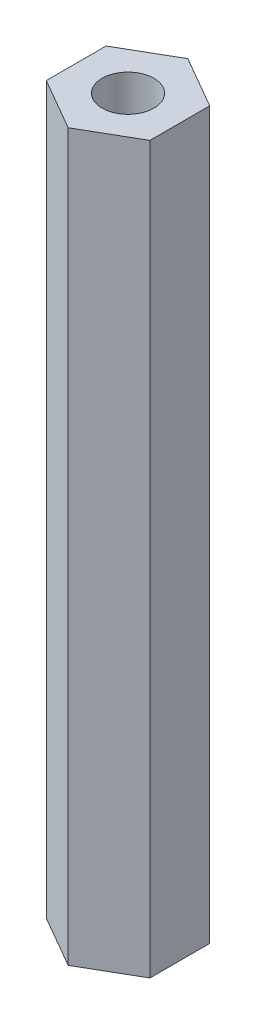
ISO-10303-21;
HEADER;
FILE_DESCRIPTION(('STEP AP214'),'2;1');
FILE_NAME('part.step','',(''),(''),'','','');
FILE_SCHEMA(('AUTOMOTIVE_DESIGN { 1 0 10303 214 1 1 1 1 }'));
ENDSEC;
DATA;
#1=APPLICATION_CONTEXT('core data for automotive mechanical design processes');
#2=APPLICATION_PROTOCOL_DEFINITION('international standard','automotive_design',2000,#1);
#3=PRODUCT_CONTEXT('',#1,'mechanical');
#4=PRODUCT('Part','Part','',(#3));
#5=PRODUCT_RELATED_PRODUCT_CATEGORY('part','',(#4));
#6=PRODUCT_DEFINITION_FORMATION('','',#4);
#7=PRODUCT_DEFINITION_CONTEXT('part definition',#1,'design');
#8=PRODUCT_DEFINITION('design','',#6,#7);
#9=PRODUCT_DEFINITION_SHAPE('','',#8);
#10=(LENGTH_UNIT() NAMED_UNIT(*) SI_UNIT(.MILLI.,.METRE.));
#11=(NAMED_UNIT(*) PLANE_ANGLE_UNIT() SI_UNIT($,.RADIAN.));
#12=(NAMED_UNIT(*) SI_UNIT($,.STERADIAN.) SOLID_ANGLE_UNIT());
#13=UNCERTAINTY_MEASURE_WITH_UNIT(LENGTH_MEASURE(1.E-05),#10,'distance_accuracy_value','');
#14=(GEOMETRIC_REPRESENTATION_CONTEXT(3) GLOBAL_UNCERTAINTY_ASSIGNED_CONTEXT((#13)) GLOBAL_UNIT_ASSIGNED_CONTEXT((#10,
#11,#12)) REPRESENTATION_CONTEXT('',''));
#15=CARTESIAN_POINT('',(0.,0.,0.));
#16=DIRECTION('',(0.,0.,1.));
#17=DIRECTION('',(1.,0.,0.));
#18=AXIS2_PLACEMENT_3D('',#15,#16,#17);
#19=CARTESIAN_POINT('',(0.,23.71137043753,0.));
#20=DIRECTION('',(0.,-1.,0.));
#21=DIRECTION('',(1.,0.,0.));
#22=AXIS2_PLACEMENT_3D('',#19,#20,#21);
#23=CYLINDRICAL_SURFACE('',#22,1.25);
#24=CARTESIAN_POINT('',(0.,35.00000000001,0.));
#25=DIRECTION('',(0.,1.,0.));
#26=DIRECTION('',(-1.,0.,0.));
#27=AXIS2_PLACEMENT_3D('',#24,#25,#26);
#28=CIRCLE('',#27,1.25);
#29=CARTESIAN_POINT('',(-1.25,35.00000000001,0.));
#30=VERTEX_POINT('',#29);
#31=EDGE_CURVE('E101',#30,#30,#28,.T.);
#32=ORIENTED_EDGE('',*,*,#31,.T.);
#33=EDGE_LOOP('',(#32));
#34=FACE_BOUND('',#33,.T.);
#35=CARTESIAN_POINT('',(0.,25.00000000001,0.));
#36=DIRECTION('',(0.,1.,0.));
#37=DIRECTION('',(1.,0.,0.));
#38=AXIS2_PLACEMENT_3D('',#35,#36,#37);
#39=CIRCLE('',#38,1.25);
#40=CARTESIAN_POINT('',(1.25,25.00000000001,0.));
#41=VERTEX_POINT('',#40);
#42=EDGE_CURVE('E11',#41,#41,#39,.T.);
#43=ORIENTED_EDGE('',*,*,#42,.F.);
#44=EDGE_LOOP('',(#43));
#45=FACE_BOUND('',#44,.T.);
#46=ADVANCED_FACE('F17',(#34,#45),#23,.F.);
#47=CARTESIAN_POINT('',(2.5,0.,1.443375672974));
#48=DIRECTION('',(1.,0.,0.));
#49=DIRECTION('',(0.,1.,0.));
#50=AXIS2_PLACEMENT_3D('',#47,#48,#49);
#51=PLANE('',#50);
#52=DIRECTION('',(0.,1.,0.));
#53=VECTOR('',#52,1.);
#54=CARTESIAN_POINT('',(2.50000000001,0.,-1.443375672984));
#55=LINE('',#54,#53);
#56=CARTESIAN_POINT('',(2.5,0.,-1.443375672974));
#57=VERTEX_POINT('',#56);
#58=CARTESIAN_POINT('',(2.5,35.,-1.443375672974));
#59=VERTEX_POINT('',#58);
#60=EDGE_CURVE('E122',#57,#59,#55,.T.);
#61=ORIENTED_EDGE('',*,*,#60,.T.);
#62=DIRECTION('',(0.,0.,-1.));
#63=VECTOR('',#62,1.);
#64=CARTESIAN_POINT('',(2.50000000001,35.00000000001,1.443375672984));
#65=LINE('',#64,#63);
#66=CARTESIAN_POINT('',(2.5,35.,1.443375672974));
#67=VERTEX_POINT('',#66);
#68=EDGE_CURVE('E105',#67,#59,#65,.T.);
#69=ORIENTED_EDGE('',*,*,#68,.F.);
#70=DIRECTION('',(0.,1.,0.));
#71=VECTOR('',#70,1.);
#72=CARTESIAN_POINT('',(2.50000000001,0.,1.443375672984));
#73=LINE('',#72,#71);
#74=CARTESIAN_POINT('',(2.5,0.,1.443375672974));
#75=VERTEX_POINT('',#74);
#76=EDGE_CURVE('E175',#75,#67,#73,.T.);
#77=ORIENTED_EDGE('',*,*,#76,.F.);
#78=DIRECTION('',(0.,0.,-1.));
#79=VECTOR('',#78,1.);
#80=CARTESIAN_POINT('',(2.50000000001,0.,1.443375672984));
#81=LINE('',#80,#79);
#82=EDGE_CURVE('E123',#75,#57,#81,.T.);
#83=ORIENTED_EDGE('',*,*,#82,.T.);
#84=EDGE_LOOP('',(#61,#69,#77,#83));
#85=FACE_BOUND('',#84,.T.);
#86=ADVANCED_FACE('F199',(#85),#51,.T.);
#87=CARTESIAN_POINT('',(0.,24.63553243691,0.));
#88=DIRECTION('',(0.,1.,0.));
#89=DIRECTION('',(1.,0.,0.));
#90=AXIS2_PLACEMENT_3D('',#87,#88,#89);
#91=CONICAL_SURFACE('',#90,0.6434241,1.0297442587);
#92=CARTESIAN_POINT('',(0.,24.24892422622,0.));
#93=VERTEX_POINT('',#92);
#94=VERTEX_LOOP('',#93);
#95=FACE_BOUND('',#94,.T.);
#96=ORIENTED_EDGE('',*,*,#42,.T.);
#97=EDGE_LOOP('',(#96));
#98=FACE_BOUND('',#97,.T.);
#99=ADVANCED_FACE('F319',(#95,#98),#91,.F.);
#100=CARTESIAN_POINT('',(0.,11.28862956247,0.));
#101=DIRECTION('',(0.,-1.,0.));
#102=DIRECTION('',(1.,0.,0.));
#103=AXIS2_PLACEMENT_3D('',#100,#101,#102);
#104=CYLINDRICAL_SURFACE('',#103,1.25);
#105=CARTESIAN_POINT('',(0.,0.,0.));
#106=DIRECTION('',(0.,1.,0.));
#107=DIRECTION('',(-1.,0.,0.));
#108=AXIS2_PLACEMENT_3D('',#105,#106,#107);
#109=CIRCLE('',#108,1.25);
#110=CARTESIAN_POINT('',(-1.25,0.,0.));
#111=VERTEX_POINT('',#110);
#112=EDGE_CURVE('E132',#111,#111,#109,.T.);
#113=ORIENTED_EDGE('',*,*,#112,.F.);
#114=EDGE_LOOP('',(#113));
#115=FACE_BOUND('',#114,.T.);
#116=CARTESIAN_POINT('',(0.,10.00000000001,0.));
#117=DIRECTION('',(0.,1.,0.));
#118=DIRECTION('',(1.,0.,0.));
#119=AXIS2_PLACEMENT_3D('',#116,#117,#118);
#120=CIRCLE('',#119,1.25);
#121=CARTESIAN_POINT('',(1.25,10.00000000001,0.));
#122=VERTEX_POINT('',#121);
#123=EDGE_CURVE('E26',#122,#122,#120,.T.);
#124=ORIENTED_EDGE('',*,*,#123,.T.);
#125=EDGE_LOOP('',(#124));
#126=FACE_BOUND('',#125,.T.);
#127=ADVANCED_FACE('F356',(#115,#126),#104,.F.);
#128=CARTESIAN_POINT('',(-2.5,0.,1.443375672974));
#129=DIRECTION('',(-0.500000000000017,0.,0.866025403784429));
#130=DIRECTION('',(0.,1.,0.));
#131=AXIS2_PLACEMENT_3D('',#128,#129,#130);
#132=PLANE('',#131);
#133=DIRECTION('',(0.,1.,0.));
#134=VECTOR('',#133,1.);
#135=CARTESIAN_POINT('',(0.,0.,2.886751345958));
#136=LINE('',#135,#134);
#137=CARTESIAN_POINT('',(0.,0.,2.886751345948));
#138=VERTEX_POINT('',#137);
#139=CARTESIAN_POINT('',(0.,35.,2.886751345948));
#140=VERTEX_POINT('',#139);
#141=EDGE_CURVE('E164',#138,#140,#136,.T.);
#142=ORIENTED_EDGE('',*,*,#141,.T.);
#143=DIRECTION('',(0.866025403783795,0.,0.500000000001115));
#144=VECTOR('',#143,1.);
#145=CARTESIAN_POINT('',(-2.50000000001,35.00000000001,1.443375672984));
#146=LINE('',#145,#144);
#147=CARTESIAN_POINT('',(-2.5,35.,1.443375672974));
#148=VERTEX_POINT('',#147);
#149=EDGE_CURVE('E112',#148,#140,#146,.T.);
#150=ORIENTED_EDGE('',*,*,#149,.F.);
#151=DIRECTION('',(0.,1.,0.));
#152=VECTOR('',#151,1.);
#153=CARTESIAN_POINT('',(-2.50000000001,0.,1.443375672984));
#154=LINE('',#153,#152);
#155=CARTESIAN_POINT('',(-2.5,0.,1.443375672974));
#156=VERTEX_POINT('',#155);
#157=EDGE_CURVE('E146',#156,#148,#154,.T.);
#158=ORIENTED_EDGE('',*,*,#157,.F.);
#159=DIRECTION('',(0.866025403783795,0.,0.500000000001115));
#160=VECTOR('',#159,1.);
#161=CARTESIAN_POINT('',(-2.50000000001,0.,1.443375672984));
#162=LINE('',#161,#160);
#163=EDGE_CURVE('E126',#156,#138,#162,.T.);
#164=ORIENTED_EDGE('',*,*,#163,.T.);
#165=EDGE_LOOP('',(#142,#150,#158,#164));
#166=FACE_BOUND('',#165,.T.);
#167=ADVANCED_FACE('F165',(#166),#132,.T.);
#168=CARTESIAN_POINT('',(0.,10.36446756309,0.));
#169=DIRECTION('',(0.,-1.,0.));
#170=DIRECTION('',(-1.,0.,0.));
#171=AXIS2_PLACEMENT_3D('',#168,#169,#170);
#172=CONICAL_SURFACE('',#171,0.6434241,1.0297442587);
#173=CARTESIAN_POINT('',(0.,10.75107577378,0.));
#174=VERTEX_POINT('',#173);
#175=VERTEX_LOOP('',#174);
#176=FACE_BOUND('',#175,.T.);
#177=ORIENTED_EDGE('',*,*,#123,.F.);
#178=EDGE_LOOP('',(#177));
#179=FACE_BOUND('',#178,.T.);
#180=ADVANCED_FACE('F339',(#176,#179),#172,.F.);
#181=CARTESIAN_POINT('',(0.,35.,0.));
#182=DIRECTION('',(0.,1.,0.));
#183=DIRECTION('',(1.,0.,0.));
#184=AXIS2_PLACEMENT_3D('',#181,#182,#183);
#185=PLANE('',#184);
#186=ORIENTED_EDGE('',*,*,#31,.F.);
#187=EDGE_LOOP('',(#186));
#188=FACE_BOUND('',#187,.T.);
#189=DIRECTION('',(0.,0.,1.));
#190=VECTOR('',#189,1.);
#191=CARTESIAN_POINT('',(-2.50000000001,35.00000000001,-1.443375672984));
#192=LINE('',#191,#190);
#193=CARTESIAN_POINT('',(-2.5,35.,-1.443375672974));
#194=VERTEX_POINT('',#193);
#195=EDGE_CURVE('E147',#194,#148,#192,.T.);
#196=ORIENTED_EDGE('',*,*,#195,.T.);
#197=ORIENTED_EDGE('',*,*,#149,.T.);
#198=DIRECTION('',(0.866025403783795,0.,-0.500000000001115));
#199=VECTOR('',#198,1.);
#200=CARTESIAN_POINT('',(0.,35.00000000001,2.886751345958));
#201=LINE('',#200,#199);
#202=EDGE_CURVE('E159',#140,#67,#201,.T.);
#203=ORIENTED_EDGE('',*,*,#202,.T.);
#204=ORIENTED_EDGE('',*,*,#68,.T.);
#205=DIRECTION('',(-0.866025403783795,0.,-0.500000000001115));
#206=VECTOR('',#205,1.);
#207=CARTESIAN_POINT('',(2.50000000001,35.00000000001,-1.443375672984));
#208=LINE('',#207,#206);
#209=CARTESIAN_POINT('',(0.,35.,-2.886751345948));
#210=VERTEX_POINT('',#209);
#211=EDGE_CURVE('E118',#59,#210,#208,.T.);
#212=ORIENTED_EDGE('',*,*,#211,.T.);
#213=DIRECTION('',(-0.866025403783795,0.,0.500000000001115));
#214=VECTOR('',#213,1.);
#215=CARTESIAN_POINT('',(0.,35.00000000001,-2.886751345958));
#216=LINE('',#215,#214);
#217=EDGE_CURVE('E142',#210,#194,#216,.T.);
#218=ORIENTED_EDGE('',*,*,#217,.T.);
#219=EDGE_LOOP('',(#196,#197,#203,#204,#212,#218));
#220=FACE_BOUND('',#219,.T.);
#221=ADVANCED_FACE('F157',(#188,#220),#185,.T.);
#222=CARTESIAN_POINT('',(-2.5,0.,-1.443375672974));
#223=DIRECTION('',(-1.,0.,0.));
#224=DIRECTION('',(0.,0.,1.));
#225=AXIS2_PLACEMENT_3D('',#222,#223,#224);
#226=PLANE('',#225);
#227=ORIENTED_EDGE('',*,*,#157,.T.);
#228=ORIENTED_EDGE('',*,*,#195,.F.);
#229=DIRECTION('',(0.,1.,0.));
#230=VECTOR('',#229,1.);
#231=CARTESIAN_POINT('',(-2.50000000001,0.,-1.443375672984));
#232=LINE('',#231,#230);
#233=CARTESIAN_POINT('',(-2.5,0.,-1.443375672974));
#234=VERTEX_POINT('',#233);
#235=EDGE_CURVE('E138',#234,#194,#232,.T.);
#236=ORIENTED_EDGE('',*,*,#235,.F.);
#237=DIRECTION('',(0.,0.,1.));
#238=VECTOR('',#237,1.);
#239=CARTESIAN_POINT('',(-2.50000000001,0.,-1.443375672984));
#240=LINE('',#239,#238);
#241=EDGE_CURVE('E133',#234,#156,#240,.T.);
#242=ORIENTED_EDGE('',*,*,#241,.T.);
#243=EDGE_LOOP('',(#227,#228,#236,#242));
#244=FACE_BOUND('',#243,.T.);
#245=ADVANCED_FACE('F190',(#244),#226,.T.);
#246=CARTESIAN_POINT('',(0.,0.,-2.886751345948));
#247=DIRECTION('',(-0.500000000000017,0.,-0.866025403784429));
#248=DIRECTION('',(-0.866025403784429,0.,0.500000000000017));
#249=AXIS2_PLACEMENT_3D('',#246,#247,#248);
#250=PLANE('',#249);
#251=ORIENTED_EDGE('',*,*,#235,.T.);
#252=ORIENTED_EDGE('',*,*,#217,.F.);
#253=DIRECTION('',(0.,1.,0.));
#254=VECTOR('',#253,1.);
#255=CARTESIAN_POINT('',(0.,0.,-2.886751345958));
#256=LINE('',#255,#254);
#257=CARTESIAN_POINT('',(0.,0.,-2.886751345948));
#258=VERTEX_POINT('',#257);
#259=EDGE_CURVE('E116',#258,#210,#256,.T.);
#260=ORIENTED_EDGE('',*,*,#259,.F.);
#261=DIRECTION('',(-0.866025403783795,0.,0.500000000001115));
#262=VECTOR('',#261,1.);
#263=CARTESIAN_POINT('',(0.,0.,-2.886751345958));
#264=LINE('',#263,#262);
#265=EDGE_CURVE('E128',#258,#234,#264,.T.);
#266=ORIENTED_EDGE('',*,*,#265,.T.);
#267=EDGE_LOOP('',(#251,#252,#260,#266));
#268=FACE_BOUND('',#267,.T.);
#269=ADVANCED_FACE('F274',(#268),#250,.T.);
#270=CARTESIAN_POINT('',(0.,0.,0.));
#271=DIRECTION('',(0.,1.,0.));
#272=DIRECTION('',(1.,0.,0.));
#273=AXIS2_PLACEMENT_3D('',#270,#271,#272);
#274=PLANE('',#273);
#275=ORIENTED_EDGE('',*,*,#112,.T.);
#276=EDGE_LOOP('',(#275));
#277=FACE_BOUND('',#276,.T.);
#278=DIRECTION('',(-0.866025403783795,0.,-0.500000000001115));
#279=VECTOR('',#278,1.);
#280=CARTESIAN_POINT('',(2.50000000001,0.,-1.443375672984));
#281=LINE('',#280,#279);
#282=EDGE_CURVE('E127',#57,#258,#281,.T.);
#283=ORIENTED_EDGE('',*,*,#282,.F.);
#284=ORIENTED_EDGE('',*,*,#82,.F.);
#285=DIRECTION('',(0.866025403783795,0.,-0.500000000001115));
#286=VECTOR('',#285,1.);
#287=CARTESIAN_POINT('',(0.,0.,2.886751345958));
#288=LINE('',#287,#286);
#289=EDGE_CURVE('E171',#138,#75,#288,.T.);
#290=ORIENTED_EDGE('',*,*,#289,.F.);
#291=ORIENTED_EDGE('',*,*,#163,.F.);
#292=ORIENTED_EDGE('',*,*,#241,.F.);
#293=ORIENTED_EDGE('',*,*,#265,.F.);
#294=EDGE_LOOP('',(#283,#284,#290,#291,#292,#293));
#295=FACE_BOUND('',#294,.T.);
#296=ADVANCED_FACE('F196',(#277,#295),#274,.F.);
#297=CARTESIAN_POINT('',(2.5,0.,-1.443375672974));
#298=DIRECTION('',(0.500000000000017,0.,-0.866025403784429));
#299=DIRECTION('',(0.,-1.,0.));
#300=AXIS2_PLACEMENT_3D('',#297,#298,#299);
#301=PLANE('',#300);
#302=ORIENTED_EDGE('',*,*,#259,.T.);
#303=ORIENTED_EDGE('',*,*,#211,.F.);
#304=ORIENTED_EDGE('',*,*,#60,.F.);
#305=ORIENTED_EDGE('',*,*,#282,.T.);
#306=EDGE_LOOP('',(#302,#303,#304,#305));
#307=FACE_BOUND('',#306,.T.);
#308=ADVANCED_FACE('F206',(#307),#301,.T.);
#309=CARTESIAN_POINT('',(0.,0.,2.886751345948));
#310=DIRECTION('',(0.500000000000017,0.,0.866025403784429));
#311=DIRECTION('',(0.,-1.,0.));
#312=AXIS2_PLACEMENT_3D('',#309,#310,#311);
#313=PLANE('',#312);
#314=ORIENTED_EDGE('',*,*,#76,.T.);
#315=ORIENTED_EDGE('',*,*,#202,.F.);
#316=ORIENTED_EDGE('',*,*,#141,.F.);
#317=ORIENTED_EDGE('',*,*,#289,.T.);
#318=EDGE_LOOP('',(#314,#315,#316,#317));
#319=FACE_BOUND('',#318,.T.);
#320=ADVANCED_FACE('F173',(#319),#313,.T.);
#321=CLOSED_SHELL('',(#46,#86,#99,#127,#167,#180,#221,#245,#269,#296,#308,#320));
#322=MANIFOLD_SOLID_BREP('B1',#321);
#323=ADVANCED_BREP_SHAPE_REPRESENTATION('',(#18,#322),#14);
#324=SHAPE_DEFINITION_REPRESENTATION(#9,#323);
ENDSEC;
END-ISO-10303-21;
